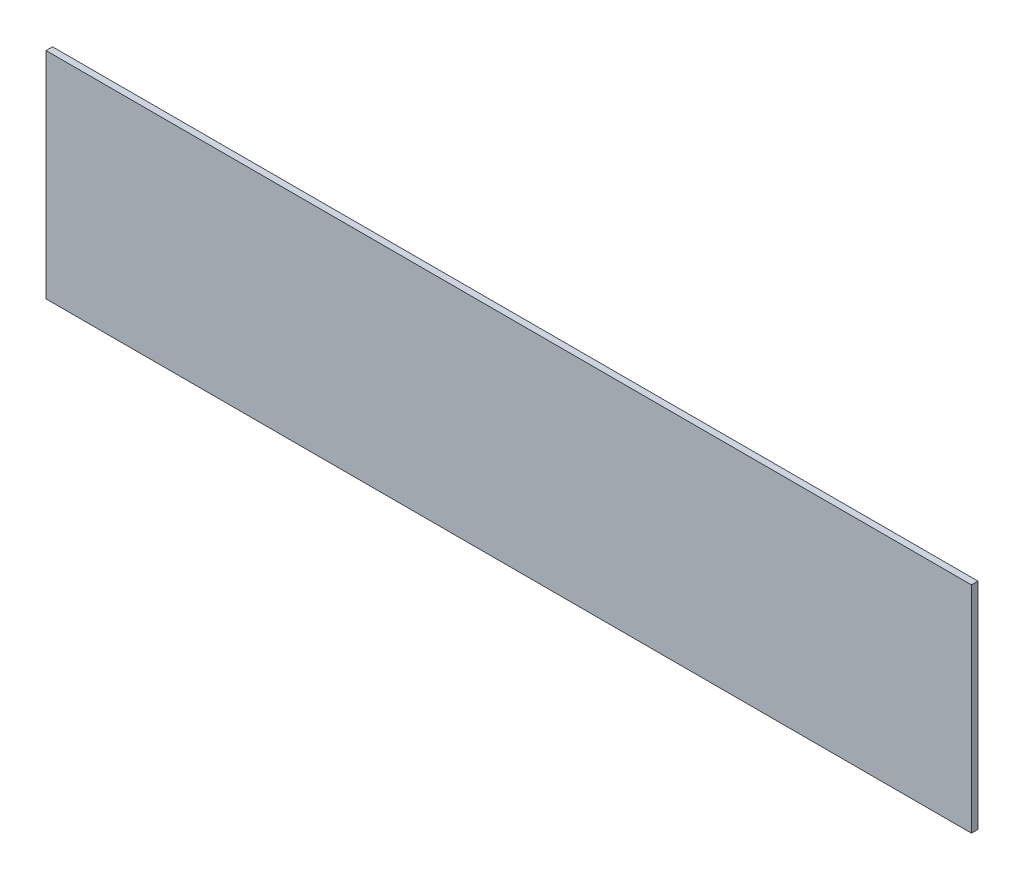
ISO-10303-21;
HEADER;
FILE_DESCRIPTION(('STEP AP214'),'2;1');
FILE_NAME('part.step','',(''),(''),'','','');
FILE_SCHEMA(('AUTOMOTIVE_DESIGN { 1 0 10303 214 1 1 1 1 }'));
ENDSEC;
DATA;
#1=APPLICATION_CONTEXT('core data for automotive mechanical design processes');
#2=APPLICATION_PROTOCOL_DEFINITION('international standard','automotive_design',2000,#1);
#3=PRODUCT_CONTEXT('',#1,'mechanical');
#4=PRODUCT('Part','Part','',(#3));
#5=PRODUCT_RELATED_PRODUCT_CATEGORY('part','',(#4));
#6=PRODUCT_DEFINITION_FORMATION('','',#4);
#7=PRODUCT_DEFINITION_CONTEXT('part definition',#1,'design');
#8=PRODUCT_DEFINITION('design','',#6,#7);
#9=PRODUCT_DEFINITION_SHAPE('','',#8);
#10=(LENGTH_UNIT() NAMED_UNIT(*) SI_UNIT(.MILLI.,.METRE.));
#11=(NAMED_UNIT(*) PLANE_ANGLE_UNIT() SI_UNIT($,.RADIAN.));
#12=(NAMED_UNIT(*) SI_UNIT($,.STERADIAN.) SOLID_ANGLE_UNIT());
#13=UNCERTAINTY_MEASURE_WITH_UNIT(LENGTH_MEASURE(1.E-05),#10,'distance_accuracy_value','');
#14=(GEOMETRIC_REPRESENTATION_CONTEXT(3) GLOBAL_UNCERTAINTY_ASSIGNED_CONTEXT((#13)) GLOBAL_UNIT_ASSIGNED_CONTEXT((#10,
#11,#12)) REPRESENTATION_CONTEXT('',''));
#15=CARTESIAN_POINT('',(0.,0.,0.));
#16=DIRECTION('',(0.,0.,1.));
#17=DIRECTION('',(1.,0.,0.));
#18=AXIS2_PLACEMENT_3D('',#15,#16,#17);
#19=CARTESIAN_POINT('',(-66.8614911408901,1.65339466773673,1.));
#20=DIRECTION('',(1.,0.,0.));
#21=DIRECTION('',(0.,0.,-1.));
#22=AXIS2_PLACEMENT_3D('',#19,#20,#21);
#23=PLANE('',#22);
#24=DIRECTION('',(0.,-1.,0.));
#25=VECTOR('',#24,1.);
#26=CARTESIAN_POINT('',(-66.8614911408901,1.65339466773673,0.));
#27=LINE('',#26,#25);
#28=CARTESIAN_POINT('',(-66.8614911408901,1.65339466773673,0.));
#29=VERTEX_POINT('',#28);
#30=CARTESIAN_POINT('',(-66.8614911408901,-31.3466053322633,0.));
#31=VERTEX_POINT('',#30);
#32=EDGE_CURVE('E107',#29,#31,#27,.T.);
#33=ORIENTED_EDGE('',*,*,#32,.T.);
#34=DIRECTION('',(0.,0.,-1.));
#35=VECTOR('',#34,1.);
#36=CARTESIAN_POINT('',(-66.8614911408901,-31.3466053322633,1.));
#37=LINE('',#36,#35);
#38=CARTESIAN_POINT('',(-66.8614911408901,-31.3466053322633,1.));
#39=VERTEX_POINT('',#38);
#40=EDGE_CURVE('E11',#39,#31,#37,.T.);
#41=ORIENTED_EDGE('',*,*,#40,.F.);
#42=DIRECTION('',(0.,-1.,0.));
#43=VECTOR('',#42,1.);
#44=CARTESIAN_POINT('',(-66.8614911408901,1.65339466773673,1.));
#45=LINE('',#44,#43);
#46=CARTESIAN_POINT('',(-66.8614911408901,1.65339466773673,1.));
#47=VERTEX_POINT('',#46);
#48=EDGE_CURVE('E91',#47,#39,#45,.T.);
#49=ORIENTED_EDGE('',*,*,#48,.F.);
#50=DIRECTION('',(0.,0.,-1.));
#51=VECTOR('',#50,1.);
#52=CARTESIAN_POINT('',(-66.8614911408901,1.65339466773673,1.));
#53=LINE('',#52,#51);
#54=EDGE_CURVE('E103',#47,#29,#53,.T.);
#55=ORIENTED_EDGE('',*,*,#54,.T.);
#56=EDGE_LOOP('',(#33,#41,#49,#55));
#57=FACE_BOUND('',#56,.T.);
#58=ADVANCED_FACE('F39',(#57),#23,.F.);
#59=CARTESIAN_POINT('',(-66.8614911408901,-31.3466053322633,1.));
#60=DIRECTION('',(0.,1.,0.));
#61=DIRECTION('',(0.,0.,1.));
#62=AXIS2_PLACEMENT_3D('',#59,#60,#61);
#63=PLANE('',#62);
#64=DIRECTION('',(1.,0.,0.));
#65=VECTOR('',#64,1.);
#66=CARTESIAN_POINT('',(-66.8614911408901,-31.3466053322633,0.));
#67=LINE('',#66,#65);
#68=CARTESIAN_POINT('',(75.1385088591099,-31.3466053322633,0.));
#69=VERTEX_POINT('',#68);
#70=EDGE_CURVE('E96',#31,#69,#67,.T.);
#71=ORIENTED_EDGE('',*,*,#70,.T.);
#72=DIRECTION('',(0.,0.,-1.));
#73=VECTOR('',#72,1.);
#74=CARTESIAN_POINT('',(75.1385088591099,-31.3466053322633,1.));
#75=LINE('',#74,#73);
#76=CARTESIAN_POINT('',(75.1385088591099,-31.3466053322633,1.));
#77=VERTEX_POINT('',#76);
#78=EDGE_CURVE('E48',#77,#69,#75,.T.);
#79=ORIENTED_EDGE('',*,*,#78,.F.);
#80=DIRECTION('',(1.,0.,0.));
#81=VECTOR('',#80,1.);
#82=CARTESIAN_POINT('',(-66.8614911408901,-31.3466053322633,1.));
#83=LINE('',#82,#81);
#84=EDGE_CURVE('E86',#39,#77,#83,.T.);
#85=ORIENTED_EDGE('',*,*,#84,.F.);
#86=ORIENTED_EDGE('',*,*,#40,.T.);
#87=EDGE_LOOP('',(#71,#79,#85,#86));
#88=FACE_BOUND('',#87,.T.);
#89=ADVANCED_FACE('F95',(#88),#63,.F.);
#90=CARTESIAN_POINT('',(75.1385088591099,1.65339466773673,1.));
#91=DIRECTION('',(-1.,0.,0.));
#92=DIRECTION('',(0.,0.,1.));
#93=AXIS2_PLACEMENT_3D('',#90,#91,#92);
#94=PLANE('',#93);
#95=DIRECTION('',(0.,1.,0.));
#96=VECTOR('',#95,1.);
#97=CARTESIAN_POINT('',(75.1385088591099,1.65339466773673,0.));
#98=LINE('',#97,#96);
#99=CARTESIAN_POINT('',(75.1385088591099,1.65339466773673,0.));
#100=VERTEX_POINT('',#99);
#101=EDGE_CURVE('E73',#69,#100,#98,.T.);
#102=ORIENTED_EDGE('',*,*,#101,.T.);
#103=DIRECTION('',(0.,0.,-1.));
#104=VECTOR('',#103,1.);
#105=CARTESIAN_POINT('',(75.1385088591099,1.65339466773673,1.));
#106=LINE('',#105,#104);
#107=CARTESIAN_POINT('',(75.1385088591099,1.65339466773673,1.));
#108=VERTEX_POINT('',#107);
#109=EDGE_CURVE('E98',#108,#100,#106,.T.);
#110=ORIENTED_EDGE('',*,*,#109,.F.);
#111=DIRECTION('',(0.,1.,0.));
#112=VECTOR('',#111,1.);
#113=CARTESIAN_POINT('',(75.1385088591099,1.65339466773673,1.));
#114=LINE('',#113,#112);
#115=EDGE_CURVE('E89',#77,#108,#114,.T.);
#116=ORIENTED_EDGE('',*,*,#115,.F.);
#117=ORIENTED_EDGE('',*,*,#78,.T.);
#118=EDGE_LOOP('',(#102,#110,#116,#117));
#119=FACE_BOUND('',#118,.T.);
#120=ADVANCED_FACE('F99',(#119),#94,.F.);
#121=CARTESIAN_POINT('',(-66.8614911408901,1.65339466773673,1.));
#122=DIRECTION('',(0.,-1.,0.));
#123=DIRECTION('',(0.,0.,-1.));
#124=AXIS2_PLACEMENT_3D('',#121,#122,#123);
#125=PLANE('',#124);
#126=DIRECTION('',(-1.,0.,0.));
#127=VECTOR('',#126,1.);
#128=CARTESIAN_POINT('',(-66.8614911408901,1.65339466773673,0.));
#129=LINE('',#128,#127);
#130=EDGE_CURVE('E79',#100,#29,#129,.T.);
#131=ORIENTED_EDGE('',*,*,#130,.T.);
#132=ORIENTED_EDGE('',*,*,#54,.F.);
#133=DIRECTION('',(-1.,0.,0.));
#134=VECTOR('',#133,1.);
#135=CARTESIAN_POINT('',(-66.8614911408901,1.65339466773673,1.));
#136=LINE('',#135,#134);
#137=EDGE_CURVE('E56',#108,#47,#136,.T.);
#138=ORIENTED_EDGE('',*,*,#137,.F.);
#139=ORIENTED_EDGE('',*,*,#109,.T.);
#140=EDGE_LOOP('',(#131,#132,#138,#139));
#141=FACE_BOUND('',#140,.T.);
#142=ADVANCED_FACE('F120',(#141),#125,.F.);
#143=CARTESIAN_POINT('',(0.,0.,1.));
#144=DIRECTION('',(0.,0.,1.));
#145=DIRECTION('',(1.,0.,0.));
#146=AXIS2_PLACEMENT_3D('',#143,#144,#145);
#147=PLANE('',#146);
#148=ORIENTED_EDGE('',*,*,#48,.T.);
#149=ORIENTED_EDGE('',*,*,#84,.T.);
#150=ORIENTED_EDGE('',*,*,#115,.T.);
#151=ORIENTED_EDGE('',*,*,#137,.T.);
#152=EDGE_LOOP('',(#148,#149,#150,#151));
#153=FACE_BOUND('',#152,.T.);
#154=ADVANCED_FACE('F87',(#153),#147,.T.);
#155=CARTESIAN_POINT('',(0.,0.,0.));
#156=DIRECTION('',(0.,0.,1.));
#157=DIRECTION('',(1.,0.,0.));
#158=AXIS2_PLACEMENT_3D('',#155,#156,#157);
#159=PLANE('',#158);
#160=ORIENTED_EDGE('',*,*,#32,.F.);
#161=ORIENTED_EDGE('',*,*,#130,.F.);
#162=ORIENTED_EDGE('',*,*,#101,.F.);
#163=ORIENTED_EDGE('',*,*,#70,.F.);
#164=EDGE_LOOP('',(#160,#161,#162,#163));
#165=FACE_BOUND('',#164,.T.);
#166=ADVANCED_FACE('F123',(#165),#159,.F.);
#167=CLOSED_SHELL('',(#58,#89,#120,#142,#154,#166));
#168=MANIFOLD_SOLID_BREP('B2',#167);
#169=ADVANCED_BREP_SHAPE_REPRESENTATION('',(#18,#168),#14);
#170=SHAPE_DEFINITION_REPRESENTATION(#9,#169);
ENDSEC;
END-ISO-10303-21;
